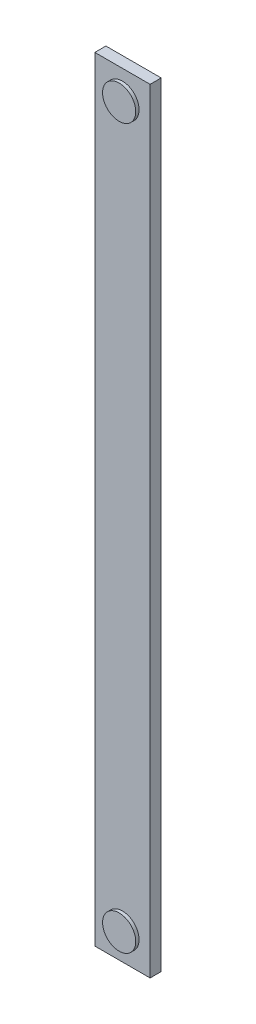
ISO-10303-21;
HEADER;
FILE_DESCRIPTION(('STEP AP214'),'2;1');
FILE_NAME('part.step','',(''),(''),'','','');
FILE_SCHEMA(('AUTOMOTIVE_DESIGN { 1 0 10303 214 1 1 1 1 }'));
ENDSEC;
DATA;
#1=APPLICATION_CONTEXT('core data for automotive mechanical design processes');
#2=APPLICATION_PROTOCOL_DEFINITION('international standard','automotive_design',2000,#1);
#3=PRODUCT_CONTEXT('',#1,'mechanical');
#4=PRODUCT('Part','Part','',(#3));
#5=PRODUCT_RELATED_PRODUCT_CATEGORY('part','',(#4));
#6=PRODUCT_DEFINITION_FORMATION('','',#4);
#7=PRODUCT_DEFINITION_CONTEXT('part definition',#1,'design');
#8=PRODUCT_DEFINITION('design','',#6,#7);
#9=PRODUCT_DEFINITION_SHAPE('','',#8);
#10=(LENGTH_UNIT() NAMED_UNIT(*) SI_UNIT(.MILLI.,.METRE.));
#11=(NAMED_UNIT(*) PLANE_ANGLE_UNIT() SI_UNIT($,.RADIAN.));
#12=(NAMED_UNIT(*) SI_UNIT($,.STERADIAN.) SOLID_ANGLE_UNIT());
#13=UNCERTAINTY_MEASURE_WITH_UNIT(LENGTH_MEASURE(1.E-05),#10,'distance_accuracy_value','');
#14=(GEOMETRIC_REPRESENTATION_CONTEXT(3) GLOBAL_UNCERTAINTY_ASSIGNED_CONTEXT((#13)) GLOBAL_UNIT_ASSIGNED_CONTEXT((#10,
#11,#12)) REPRESENTATION_CONTEXT('',''));
#15=CARTESIAN_POINT('',(0.,0.,0.));
#16=DIRECTION('',(0.,0.,1.));
#17=DIRECTION('',(1.,0.,0.));
#18=AXIS2_PLACEMENT_3D('',#15,#16,#17);
#19=CARTESIAN_POINT('',(25.,350.,5.));
#20=DIRECTION('',(-1.,0.,0.));
#21=DIRECTION('',(0.,-1.,0.));
#22=AXIS2_PLACEMENT_3D('',#19,#20,#21);
#23=PLANE('',#22);
#24=DIRECTION('',(0.,1.,0.));
#25=VECTOR('',#24,1.);
#26=CARTESIAN_POINT('',(25.,350.,-5.));
#27=LINE('',#26,#25);
#28=CARTESIAN_POINT('',(25.,-350.,-5.));
#29=VERTEX_POINT('',#28);
#30=CARTESIAN_POINT('',(25.,350.,-5.));
#31=VERTEX_POINT('',#30);
#32=EDGE_CURVE('E99',#29,#31,#27,.T.);
#33=ORIENTED_EDGE('',*,*,#32,.T.);
#34=DIRECTION('',(0.,0.,-1.));
#35=VECTOR('',#34,1.);
#36=CARTESIAN_POINT('',(25.,350.,5.));
#37=LINE('',#36,#35);
#38=CARTESIAN_POINT('',(25.,350.,5.));
#39=VERTEX_POINT('',#38);
#40=EDGE_CURVE('E11',#39,#31,#37,.T.);
#41=ORIENTED_EDGE('',*,*,#40,.F.);
#42=DIRECTION('',(0.,1.,0.));
#43=VECTOR('',#42,1.);
#44=CARTESIAN_POINT('',(25.,350.,5.));
#45=LINE('',#44,#43);
#46=CARTESIAN_POINT('',(25.,-350.,5.));
#47=VERTEX_POINT('',#46);
#48=EDGE_CURVE('E87',#47,#39,#45,.T.);
#49=ORIENTED_EDGE('',*,*,#48,.F.);
#50=DIRECTION('',(0.,0.,-1.));
#51=VECTOR('',#50,1.);
#52=CARTESIAN_POINT('',(25.,-350.,5.));
#53=LINE('',#52,#51);
#54=EDGE_CURVE('E95',#47,#29,#53,.T.);
#55=ORIENTED_EDGE('',*,*,#54,.T.);
#56=EDGE_LOOP('',(#33,#41,#49,#55));
#57=FACE_BOUND('',#56,.T.);
#58=ADVANCED_FACE('F36',(#57),#23,.F.);
#59=CARTESIAN_POINT('',(-25.,350.,5.));
#60=DIRECTION('',(0.,-1.,0.));
#61=DIRECTION('',(0.,0.,-1.));
#62=AXIS2_PLACEMENT_3D('',#59,#60,#61);
#63=PLANE('',#62);
#64=DIRECTION('',(-1.,0.,0.));
#65=VECTOR('',#64,1.);
#66=CARTESIAN_POINT('',(-25.,350.,-5.));
#67=LINE('',#66,#65);
#68=CARTESIAN_POINT('',(-25.,350.,-5.));
#69=VERTEX_POINT('',#68);
#70=EDGE_CURVE('E91',#31,#69,#67,.T.);
#71=ORIENTED_EDGE('',*,*,#70,.T.);
#72=DIRECTION('',(0.,0.,-1.));
#73=VECTOR('',#72,1.);
#74=CARTESIAN_POINT('',(-25.,350.,5.));
#75=LINE('',#74,#73);
#76=CARTESIAN_POINT('',(-25.,350.,5.));
#77=VERTEX_POINT('',#76);
#78=EDGE_CURVE('E44',#77,#69,#75,.T.);
#79=ORIENTED_EDGE('',*,*,#78,.F.);
#80=DIRECTION('',(-1.,0.,0.));
#81=VECTOR('',#80,1.);
#82=CARTESIAN_POINT('',(-25.,350.,5.));
#83=LINE('',#82,#81);
#84=EDGE_CURVE('E82',#39,#77,#83,.T.);
#85=ORIENTED_EDGE('',*,*,#84,.F.);
#86=ORIENTED_EDGE('',*,*,#40,.T.);
#87=EDGE_LOOP('',(#71,#79,#85,#86));
#88=FACE_BOUND('',#87,.T.);
#89=ADVANCED_FACE('F90',(#88),#63,.F.);
#90=CARTESIAN_POINT('',(-25.,350.,5.));
#91=DIRECTION('',(1.,0.,0.));
#92=DIRECTION('',(0.,1.,0.));
#93=AXIS2_PLACEMENT_3D('',#90,#91,#92);
#94=PLANE('',#93);
#95=DIRECTION('',(0.,-1.,0.));
#96=VECTOR('',#95,1.);
#97=CARTESIAN_POINT('',(-25.,350.,-5.));
#98=LINE('',#97,#96);
#99=CARTESIAN_POINT('',(-25.,-350.,-5.));
#100=VERTEX_POINT('',#99);
#101=EDGE_CURVE('E69',#69,#100,#98,.T.);
#102=ORIENTED_EDGE('',*,*,#101,.T.);
#103=DIRECTION('',(0.,0.,-1.));
#104=VECTOR('',#103,1.);
#105=CARTESIAN_POINT('',(-25.,-350.,5.));
#106=LINE('',#105,#104);
#107=CARTESIAN_POINT('',(-25.,-350.,5.));
#108=VERTEX_POINT('',#107);
#109=EDGE_CURVE('E92',#108,#100,#106,.T.);
#110=ORIENTED_EDGE('',*,*,#109,.F.);
#111=DIRECTION('',(0.,-1.,0.));
#112=VECTOR('',#111,1.);
#113=CARTESIAN_POINT('',(-25.,350.,5.));
#114=LINE('',#113,#112);
#115=EDGE_CURVE('E85',#77,#108,#114,.T.);
#116=ORIENTED_EDGE('',*,*,#115,.F.);
#117=ORIENTED_EDGE('',*,*,#78,.T.);
#118=EDGE_LOOP('',(#102,#110,#116,#117));
#119=FACE_BOUND('',#118,.T.);
#120=ADVANCED_FACE('F93',(#119),#94,.F.);
#121=CARTESIAN_POINT('',(-25.,-350.,5.));
#122=DIRECTION('',(0.,1.,0.));
#123=DIRECTION('',(0.,0.,1.));
#124=AXIS2_PLACEMENT_3D('',#121,#122,#123);
#125=PLANE('',#124);
#126=DIRECTION('',(1.,0.,0.));
#127=VECTOR('',#126,1.);
#128=CARTESIAN_POINT('',(-25.,-350.,-5.));
#129=LINE('',#128,#127);
#130=EDGE_CURVE('E75',#100,#29,#129,.T.);
#131=ORIENTED_EDGE('',*,*,#130,.T.);
#132=ORIENTED_EDGE('',*,*,#54,.F.);
#133=DIRECTION('',(1.,0.,0.));
#134=VECTOR('',#133,1.);
#135=CARTESIAN_POINT('',(-25.,-350.,5.));
#136=LINE('',#135,#134);
#137=EDGE_CURVE('E52',#108,#47,#136,.T.);
#138=ORIENTED_EDGE('',*,*,#137,.F.);
#139=ORIENTED_EDGE('',*,*,#109,.T.);
#140=EDGE_LOOP('',(#131,#132,#138,#139));
#141=FACE_BOUND('',#140,.T.);
#142=ADVANCED_FACE('F107',(#141),#125,.F.);
#143=CARTESIAN_POINT('',(0.,0.,5.));
#144=DIRECTION('',(0.,0.,1.));
#145=DIRECTION('',(1.,0.,0.));
#146=AXIS2_PLACEMENT_3D('',#143,#144,#145);
#147=PLANE('',#146);
#148=CARTESIAN_POINT('',(0.,325.,5.));
#149=DIRECTION('',(0.,0.,1.));
#150=DIRECTION('',(1.,0.,0.));
#151=AXIS2_PLACEMENT_3D('',#148,#149,#150);
#152=CIRCLE('',#151,15.);
#153=CARTESIAN_POINT('',(15.,325.,5.));
#154=VERTEX_POINT('',#153);
#155=EDGE_CURVE('E119',#154,#154,#152,.T.);
#156=ORIENTED_EDGE('',*,*,#155,.F.);
#157=EDGE_LOOP('',(#156));
#158=FACE_BOUND('',#157,.T.);
#159=CARTESIAN_POINT('',(0.,-325.,5.));
#160=DIRECTION('',(0.,0.,1.));
#161=DIRECTION('',(1.,0.,0.));
#162=AXIS2_PLACEMENT_3D('',#159,#160,#161);
#163=CIRCLE('',#162,15.);
#164=CARTESIAN_POINT('',(15.,-325.,5.));
#165=VERTEX_POINT('',#164);
#166=EDGE_CURVE('E113',#165,#165,#163,.T.);
#167=ORIENTED_EDGE('',*,*,#166,.F.);
#168=EDGE_LOOP('',(#167));
#169=FACE_BOUND('',#168,.T.);
#170=ORIENTED_EDGE('',*,*,#48,.T.);
#171=ORIENTED_EDGE('',*,*,#84,.T.);
#172=ORIENTED_EDGE('',*,*,#115,.T.);
#173=ORIENTED_EDGE('',*,*,#137,.T.);
#174=EDGE_LOOP('',(#170,#171,#172,#173));
#175=FACE_BOUND('',#174,.T.);
#176=ADVANCED_FACE('F83',(#158,#169,#175),#147,.T.);
#177=CARTESIAN_POINT('',(0.,0.,-5.));
#178=DIRECTION('',(0.,0.,1.));
#179=DIRECTION('',(1.,0.,0.));
#180=AXIS2_PLACEMENT_3D('',#177,#178,#179);
#181=PLANE('',#180);
#182=ORIENTED_EDGE('',*,*,#32,.F.);
#183=ORIENTED_EDGE('',*,*,#130,.F.);
#184=ORIENTED_EDGE('',*,*,#101,.F.);
#185=ORIENTED_EDGE('',*,*,#70,.F.);
#186=EDGE_LOOP('',(#182,#183,#184,#185));
#187=FACE_BOUND('',#186,.T.);
#188=ADVANCED_FACE('F110',(#187),#181,.F.);
#189=CARTESIAN_POINT('',(0.,-325.,8.));
#190=DIRECTION('',(0.,0.,-1.));
#191=DIRECTION('',(-1.,0.,0.));
#192=AXIS2_PLACEMENT_3D('',#189,#190,#191);
#193=CYLINDRICAL_SURFACE('',#192,15.);
#194=CARTESIAN_POINT('',(0.,-325.,8.));
#195=DIRECTION('',(0.,0.,1.));
#196=DIRECTION('',(1.,0.,0.));
#197=AXIS2_PLACEMENT_3D('',#194,#195,#196);
#198=CIRCLE('',#197,15.);
#199=CARTESIAN_POINT('',(15.,-325.,8.));
#200=VERTEX_POINT('',#199);
#201=EDGE_CURVE('E102',#200,#200,#198,.T.);
#202=ORIENTED_EDGE('',*,*,#201,.F.);
#203=EDGE_LOOP('',(#202));
#204=FACE_BOUND('',#203,.T.);
#205=ORIENTED_EDGE('',*,*,#166,.T.);
#206=EDGE_LOOP('',(#205));
#207=FACE_BOUND('',#206,.T.);
#208=ADVANCED_FACE('F139',(#204,#207),#193,.T.);
#209=CARTESIAN_POINT('',(0.,-325.,8.));
#210=DIRECTION('',(0.,0.,1.));
#211=DIRECTION('',(1.,0.,0.));
#212=AXIS2_PLACEMENT_3D('',#209,#210,#211);
#213=PLANE('',#212);
#214=ORIENTED_EDGE('',*,*,#201,.T.);
#215=EDGE_LOOP('',(#214));
#216=FACE_BOUND('',#215,.T.);
#217=ADVANCED_FACE('F130',(#216),#213,.T.);
#218=CARTESIAN_POINT('',(0.,325.,8.));
#219=DIRECTION('',(0.,0.,-1.));
#220=DIRECTION('',(-1.,0.,0.));
#221=AXIS2_PLACEMENT_3D('',#218,#219,#220);
#222=CYLINDRICAL_SURFACE('',#221,15.);
#223=CARTESIAN_POINT('',(0.,325.,8.));
#224=DIRECTION('',(0.,0.,1.));
#225=DIRECTION('',(1.,0.,0.));
#226=AXIS2_PLACEMENT_3D('',#223,#224,#225);
#227=CIRCLE('',#226,15.);
#228=CARTESIAN_POINT('',(15.,325.,8.));
#229=VERTEX_POINT('',#228);
#230=EDGE_CURVE('E116',#229,#229,#227,.T.);
#231=ORIENTED_EDGE('',*,*,#230,.F.);
#232=EDGE_LOOP('',(#231));
#233=FACE_BOUND('',#232,.T.);
#234=ORIENTED_EDGE('',*,*,#155,.T.);
#235=EDGE_LOOP('',(#234));
#236=FACE_BOUND('',#235,.T.);
#237=ADVANCED_FACE('F127',(#233,#236),#222,.T.);
#238=CARTESIAN_POINT('',(0.,325.,8.));
#239=DIRECTION('',(0.,0.,1.));
#240=DIRECTION('',(1.,0.,0.));
#241=AXIS2_PLACEMENT_3D('',#238,#239,#240);
#242=PLANE('',#241);
#243=ORIENTED_EDGE('',*,*,#230,.T.);
#244=EDGE_LOOP('',(#243));
#245=FACE_BOUND('',#244,.T.);
#246=ADVANCED_FACE('F125',(#245),#242,.T.);
#247=CLOSED_SHELL('',(#58,#89,#120,#142,#176,#188,#208,#217,#237,#246));
#248=MANIFOLD_SOLID_BREP('B2',#247);
#249=ADVANCED_BREP_SHAPE_REPRESENTATION('',(#18,#248),#14);
#250=SHAPE_DEFINITION_REPRESENTATION(#9,#249);
ENDSEC;
END-ISO-10303-21;
